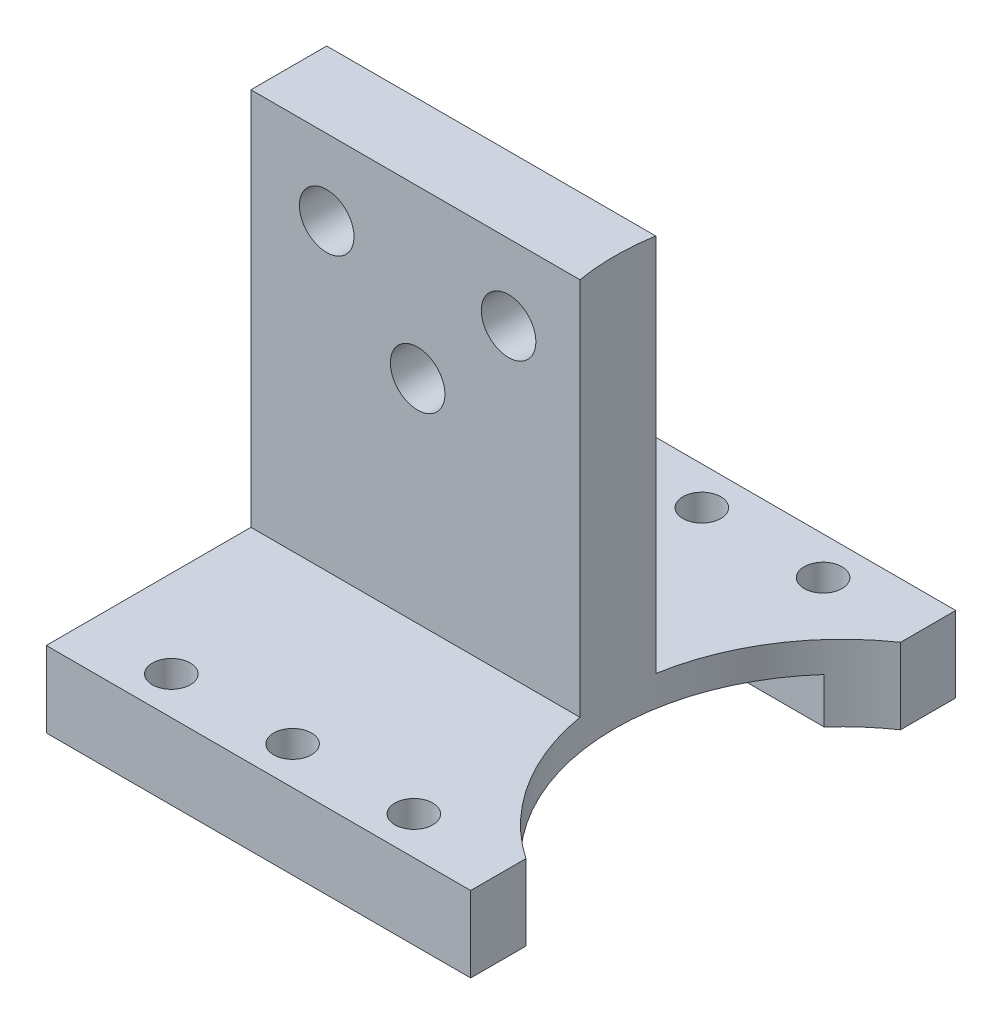
ISO-10303-21;
HEADER;
FILE_DESCRIPTION(('STEP AP214'),'2;1');
FILE_NAME('part.step','',(''),(''),'','','');
FILE_SCHEMA(('AUTOMOTIVE_DESIGN { 1 0 10303 214 1 1 1 1 }'));
ENDSEC;
DATA;
#1=APPLICATION_CONTEXT('core data for automotive mechanical design processes');
#2=APPLICATION_PROTOCOL_DEFINITION('international standard','automotive_design',2000,#1);
#3=PRODUCT_CONTEXT('',#1,'mechanical');
#4=PRODUCT('Part','Part','',(#3));
#5=PRODUCT_RELATED_PRODUCT_CATEGORY('part','',(#4));
#6=PRODUCT_DEFINITION_FORMATION('','',#4);
#7=PRODUCT_DEFINITION_CONTEXT('part definition',#1,'design');
#8=PRODUCT_DEFINITION('design','',#6,#7);
#9=PRODUCT_DEFINITION_SHAPE('','',#8);
#10=(LENGTH_UNIT() NAMED_UNIT(*) SI_UNIT(.MILLI.,.METRE.));
#11=(NAMED_UNIT(*) PLANE_ANGLE_UNIT() SI_UNIT($,.RADIAN.));
#12=(NAMED_UNIT(*) SI_UNIT($,.STERADIAN.) SOLID_ANGLE_UNIT());
#13=UNCERTAINTY_MEASURE_WITH_UNIT(LENGTH_MEASURE(1.E-05),#10,'distance_accuracy_value','');
#14=(GEOMETRIC_REPRESENTATION_CONTEXT(3) GLOBAL_UNCERTAINTY_ASSIGNED_CONTEXT((#13)) GLOBAL_UNIT_ASSIGNED_CONTEXT((#10,
#11,#12)) REPRESENTATION_CONTEXT('',''));
#15=CARTESIAN_POINT('',(0.,0.,0.));
#16=DIRECTION('',(0.,0.,1.));
#17=DIRECTION('',(1.,0.,0.));
#18=AXIS2_PLACEMENT_3D('',#15,#16,#17);
#19=CARTESIAN_POINT('',(14.,0.,0.));
#20=DIRECTION('',(-1.,0.,0.));
#21=DIRECTION('',(0.,0.,1.));
#22=AXIS2_PLACEMENT_3D('',#19,#20,#21);
#23=PLANE('',#22);
#24=DIRECTION('',(0.,0.,-1.));
#25=VECTOR('',#24,1.);
#26=CARTESIAN_POINT('',(14.,-3.,16.));
#27=LINE('',#26,#25);
#28=CARTESIAN_POINT('',(14.,-3.,16.));
#29=VERTEX_POINT('',#28);
#30=CARTESIAN_POINT('',(14.,-3.,12.3592070943073));
#31=VERTEX_POINT('',#30);
#32=EDGE_CURVE('E174',#29,#31,#27,.T.);
#33=ORIENTED_EDGE('',*,*,#32,.T.);
#34=DIRECTION('',(0.,1.,0.));
#35=VECTOR('',#34,1.);
#36=CARTESIAN_POINT('',(14.,-7.,12.3592070943073));
#37=LINE('',#36,#35);
#38=CARTESIAN_POINT('',(14.,2.,12.3592070943073));
#39=VERTEX_POINT('',#38);
#40=EDGE_CURVE('E11',#31,#39,#37,.T.);
#41=ORIENTED_EDGE('',*,*,#40,.T.);
#42=DIRECTION('',(0.,0.,1.));
#43=VECTOR('',#42,1.);
#44=CARTESIAN_POINT('',(14.,2.,2.5));
#45=LINE('',#44,#43);
#46=CARTESIAN_POINT('',(14.,2.,16.));
#47=VERTEX_POINT('',#46);
#48=EDGE_CURVE('E279',#39,#47,#45,.T.);
#49=ORIENTED_EDGE('',*,*,#48,.T.);
#50=DIRECTION('',(0.,-1.,0.));
#51=VECTOR('',#50,1.);
#52=CARTESIAN_POINT('',(14.,2.,16.));
#53=LINE('',#52,#51);
#54=EDGE_CURVE('E281',#47,#29,#53,.T.);
#55=ORIENTED_EDGE('',*,*,#54,.T.);
#56=EDGE_LOOP('',(#33,#41,#49,#55));
#57=FACE_BOUND('',#56,.T.);
#58=ADVANCED_FACE('F41',(#57),#23,.F.);
#59=CARTESIAN_POINT('',(0.,2.,0.));
#60=DIRECTION('',(0.,1.,0.));
#61=DIRECTION('',(0.,0.,1.));
#62=AXIS2_PLACEMENT_3D('',#59,#60,#61);
#63=PLANE('',#62);
#64=CARTESIAN_POINT('',(22.5000000000015,2.,0.));
#65=DIRECTION('',(0.,1.,0.));
#66=DIRECTION('',(0.,0.,1.));
#67=AXIS2_PLACEMENT_3D('',#64,#65,#66);
#68=CIRCLE('',#67,15.);
#69=CARTESIAN_POINT('',(14.,2.,-12.3592070943071));
#70=VERTEX_POINT('',#69);
#71=CARTESIAN_POINT('',(7.7098005422525,2.,-2.5));
#72=VERTEX_POINT('',#71);
#73=EDGE_CURVE('E148',#70,#72,#68,.T.);
#74=ORIENTED_EDGE('',*,*,#73,.F.);
#75=DIRECTION('',(0.,0.,1.));
#76=VECTOR('',#75,1.);
#77=CARTESIAN_POINT('',(14.,2.,-16.));
#78=LINE('',#77,#76);
#79=CARTESIAN_POINT('',(14.,2.,-16.));
#80=VERTEX_POINT('',#79);
#81=EDGE_CURVE('E265',#80,#70,#78,.T.);
#82=ORIENTED_EDGE('',*,*,#81,.F.);
#83=DIRECTION('',(1.,0.,0.));
#84=VECTOR('',#83,1.);
#85=CARTESIAN_POINT('',(0.,2.,-16.));
#86=LINE('',#85,#84);
#87=CARTESIAN_POINT('',(-14.,2.,-16.));
#88=VERTEX_POINT('',#87);
#89=EDGE_CURVE('E235',#88,#80,#86,.T.);
#90=ORIENTED_EDGE('',*,*,#89,.F.);
#91=DIRECTION('',(0.,0.,-1.));
#92=VECTOR('',#91,1.);
#93=CARTESIAN_POINT('',(-14.,2.,0.));
#94=LINE('',#93,#92);
#95=CARTESIAN_POINT('',(-14.,2.,-2.5));
#96=VERTEX_POINT('',#95);
#97=EDGE_CURVE('E237',#96,#88,#94,.T.);
#98=ORIENTED_EDGE('',*,*,#97,.F.);
#99=DIRECTION('',(-1.,0.,0.));
#100=VECTOR('',#99,1.);
#101=CARTESIAN_POINT('',(10.,2.,-2.5));
#102=LINE('',#101,#100);
#103=EDGE_CURVE('E65',#72,#96,#102,.T.);
#104=ORIENTED_EDGE('',*,*,#103,.F.);
#105=EDGE_LOOP('',(#74,#82,#90,#98,#104));
#106=FACE_BOUND('',#105,.T.);
#107=CARTESIAN_POINT('',(7.75000000000074,2.,-13.5));
#108=DIRECTION('',(0.,1.,0.));
#109=DIRECTION('',(0.,0.,1.));
#110=AXIS2_PLACEMENT_3D('',#107,#108,#109);
#111=CIRCLE('',#110,1.25);
#112=CARTESIAN_POINT('',(7.75000000000074,2.,-12.25));
#113=VERTEX_POINT('',#112);
#114=EDGE_CURVE('E220',#113,#113,#111,.T.);
#115=ORIENTED_EDGE('',*,*,#114,.F.);
#116=EDGE_LOOP('',(#115));
#117=FACE_BOUND('',#116,.T.);
#118=CARTESIAN_POINT('',(-0.249999999999261,2.,-13.4999999999999));
#119=DIRECTION('',(0.,1.,0.));
#120=DIRECTION('',(0.,0.,1.));
#121=AXIS2_PLACEMENT_3D('',#118,#119,#120);
#122=CIRCLE('',#121,1.25);
#123=CARTESIAN_POINT('',(-0.249999999999261,2.,-12.2499999999999));
#124=VERTEX_POINT('',#123);
#125=EDGE_CURVE('E217',#124,#124,#122,.T.);
#126=ORIENTED_EDGE('',*,*,#125,.F.);
#127=EDGE_LOOP('',(#126));
#128=FACE_BOUND('',#127,.T.);
#129=CARTESIAN_POINT('',(-8.24999999999926,2.,-13.4999999999999));
#130=DIRECTION('',(0.,1.,0.));
#131=DIRECTION('',(0.,0.,1.));
#132=AXIS2_PLACEMENT_3D('',#129,#130,#131);
#133=CIRCLE('',#132,1.25);
#134=CARTESIAN_POINT('',(-8.24999999999926,2.,-12.2499999999999));
#135=VERTEX_POINT('',#134);
#136=EDGE_CURVE('E178',#135,#135,#133,.T.);
#137=ORIENTED_EDGE('',*,*,#136,.F.);
#138=EDGE_LOOP('',(#137));
#139=FACE_BOUND('',#138,.T.);
#140=ADVANCED_FACE('F350',(#106,#117,#128,#139),#63,.T.);
#141=CARTESIAN_POINT('',(22.5000000000015,2.,0.));
#142=DIRECTION('',(0.,1.,0.));
#143=DIRECTION('',(0.,0.,1.));
#144=AXIS2_PLACEMENT_3D('',#141,#142,#143);
#145=CIRCLE('',#144,15.);
#146=CARTESIAN_POINT('',(7.70980054225247,2.,2.5));
#147=VERTEX_POINT('',#146);
#148=EDGE_CURVE('E274',#147,#39,#145,.T.);
#149=ORIENTED_EDGE('',*,*,#148,.F.);
#150=DIRECTION('',(1.,0.,0.));
#151=VECTOR('',#150,1.);
#152=CARTESIAN_POINT('',(9.99999999999999,2.,2.5));
#153=LINE('',#152,#151);
#154=CARTESIAN_POINT('',(-14.,2.,2.5));
#155=VERTEX_POINT('',#154);
#156=EDGE_CURVE('E171',#155,#147,#153,.T.);
#157=ORIENTED_EDGE('',*,*,#156,.F.);
#158=CARTESIAN_POINT('',(-14.,2.,16.));
#159=VERTEX_POINT('',#158);
#160=EDGE_CURVE('E183',#159,#155,#94,.T.);
#161=ORIENTED_EDGE('',*,*,#160,.F.);
#162=DIRECTION('',(1.,0.,0.));
#163=VECTOR('',#162,1.);
#164=CARTESIAN_POINT('',(0.,2.,16.));
#165=LINE('',#164,#163);
#166=EDGE_CURVE('E232',#159,#47,#165,.T.);
#167=ORIENTED_EDGE('',*,*,#166,.T.);
#168=ORIENTED_EDGE('',*,*,#48,.F.);
#169=EDGE_LOOP('',(#149,#157,#161,#167,#168));
#170=FACE_BOUND('',#169,.T.);
#171=CARTESIAN_POINT('',(-8.24999999999917,2.,13.5000000000001));
#172=DIRECTION('',(0.,1.,0.));
#173=DIRECTION('',(0.,0.,1.));
#174=AXIS2_PLACEMENT_3D('',#171,#172,#173);
#175=CIRCLE('',#174,1.25);
#176=CARTESIAN_POINT('',(-8.24999999999917,2.,14.7500000000001));
#177=VERTEX_POINT('',#176);
#178=EDGE_CURVE('E223',#177,#177,#175,.T.);
#179=ORIENTED_EDGE('',*,*,#178,.F.);
#180=EDGE_LOOP('',(#179));
#181=FACE_BOUND('',#180,.T.);
#182=CARTESIAN_POINT('',(-0.249999999999171,2.,13.5000000000001));
#183=DIRECTION('',(0.,1.,0.));
#184=DIRECTION('',(0.,0.,1.));
#185=AXIS2_PLACEMENT_3D('',#182,#183,#184);
#186=CIRCLE('',#185,1.25);
#187=CARTESIAN_POINT('',(-0.249999999999171,2.,14.7500000000001));
#188=VERTEX_POINT('',#187);
#189=EDGE_CURVE('E226',#188,#188,#186,.T.);
#190=ORIENTED_EDGE('',*,*,#189,.F.);
#191=EDGE_LOOP('',(#190));
#192=FACE_BOUND('',#191,.T.);
#193=CARTESIAN_POINT('',(7.75000000000083,2.,13.5));
#194=DIRECTION('',(0.,1.,0.));
#195=DIRECTION('',(0.,0.,1.));
#196=AXIS2_PLACEMENT_3D('',#193,#194,#195);
#197=CIRCLE('',#196,1.25);
#198=CARTESIAN_POINT('',(7.75000000000083,2.,14.75));
#199=VERTEX_POINT('',#198);
#200=EDGE_CURVE('E229',#199,#199,#197,.T.);
#201=ORIENTED_EDGE('',*,*,#200,.F.);
#202=EDGE_LOOP('',(#201));
#203=FACE_BOUND('',#202,.T.);
#204=ADVANCED_FACE('F294',(#170,#181,#192,#203),#63,.T.);
#205=CARTESIAN_POINT('',(0.,0.,0.));
#206=DIRECTION('',(0.,1.,0.));
#207=DIRECTION('',(0.,0.,1.));
#208=AXIS2_PLACEMENT_3D('',#205,#206,#207);
#209=PLANE('',#208);
#210=DIRECTION('',(-1.,0.,0.));
#211=VECTOR('',#210,1.);
#212=CARTESIAN_POINT('',(-10.,0.,-10.));
#213=LINE('',#212,#211);
#214=CARTESIAN_POINT('',(11.3196601125026,0.,-10.));
#215=VERTEX_POINT('',#214);
#216=CARTESIAN_POINT('',(-10.,0.,-10.));
#217=VERTEX_POINT('',#216);
#218=EDGE_CURVE('E242',#215,#217,#213,.T.);
#219=ORIENTED_EDGE('',*,*,#218,.F.);
#220=CARTESIAN_POINT('',(22.5000000000015,0.,0.));
#221=DIRECTION('',(0.,1.,0.));
#222=DIRECTION('',(0.,0.,1.));
#223=AXIS2_PLACEMENT_3D('',#220,#221,#222);
#224=CIRCLE('',#223,15.);
#225=CARTESIAN_POINT('',(11.3196601125025,0.,10.));
#226=VERTEX_POINT('',#225);
#227=EDGE_CURVE('E303',#215,#226,#224,.T.);
#228=ORIENTED_EDGE('',*,*,#227,.T.);
#229=DIRECTION('',(1.,0.,0.));
#230=VECTOR('',#229,1.);
#231=CARTESIAN_POINT('',(-10.,0.,10.));
#232=LINE('',#231,#230);
#233=CARTESIAN_POINT('',(-10.,0.,10.));
#234=VERTEX_POINT('',#233);
#235=EDGE_CURVE('E255',#234,#226,#232,.T.);
#236=ORIENTED_EDGE('',*,*,#235,.F.);
#237=DIRECTION('',(0.,0.,1.));
#238=VECTOR('',#237,1.);
#239=CARTESIAN_POINT('',(-10.,0.,-10.));
#240=LINE('',#239,#238);
#241=EDGE_CURVE('E252',#217,#234,#240,.T.);
#242=ORIENTED_EDGE('',*,*,#241,.F.);
#243=EDGE_LOOP('',(#219,#228,#236,#242));
#244=FACE_BOUND('',#243,.T.);
#245=ADVANCED_FACE('F43',(#244),#209,.F.);
#246=CARTESIAN_POINT('',(0.,-3.,-10.));
#247=DIRECTION('',(0.,0.,-1.));
#248=DIRECTION('',(-1.,0.,0.));
#249=AXIS2_PLACEMENT_3D('',#246,#247,#248);
#250=PLANE('',#249);
#251=DIRECTION('',(-1.,0.,0.));
#252=VECTOR('',#251,1.);
#253=CARTESIAN_POINT('',(0.,-3.,-10.));
#254=LINE('',#253,#252);
#255=CARTESIAN_POINT('',(11.3196601125026,-3.,-10.));
#256=VERTEX_POINT('',#255);
#257=CARTESIAN_POINT('',(-10.,-3.,-10.));
#258=VERTEX_POINT('',#257);
#259=EDGE_CURVE('E206',#256,#258,#254,.T.);
#260=ORIENTED_EDGE('',*,*,#259,.F.);
#261=DIRECTION('',(0.,1.,0.));
#262=VECTOR('',#261,1.);
#263=CARTESIAN_POINT('',(11.3196601125026,-7.,-10.));
#264=LINE('',#263,#262);
#265=EDGE_CURVE('E306',#256,#215,#264,.T.);
#266=ORIENTED_EDGE('',*,*,#265,.T.);
#267=ORIENTED_EDGE('',*,*,#218,.T.);
#268=DIRECTION('',(0.,1.,0.));
#269=VECTOR('',#268,1.);
#270=CARTESIAN_POINT('',(-10.,-3.,-10.));
#271=LINE('',#270,#269);
#272=EDGE_CURVE('E246',#258,#217,#271,.T.);
#273=ORIENTED_EDGE('',*,*,#272,.F.);
#274=EDGE_LOOP('',(#260,#266,#267,#273));
#275=FACE_BOUND('',#274,.T.);
#276=ADVANCED_FACE('F449',(#275),#250,.F.);
#277=CARTESIAN_POINT('',(-10.,-3.,0.));
#278=DIRECTION('',(-1.,0.,0.));
#279=DIRECTION('',(0.,0.,1.));
#280=AXIS2_PLACEMENT_3D('',#277,#278,#279);
#281=PLANE('',#280);
#282=ORIENTED_EDGE('',*,*,#272,.T.);
#283=ORIENTED_EDGE('',*,*,#241,.T.);
#284=DIRECTION('',(0.,1.,0.));
#285=VECTOR('',#284,1.);
#286=CARTESIAN_POINT('',(-10.,-3.,10.));
#287=LINE('',#286,#285);
#288=CARTESIAN_POINT('',(-10.,-3.,10.));
#289=VERTEX_POINT('',#288);
#290=EDGE_CURVE('E214',#289,#234,#287,.T.);
#291=ORIENTED_EDGE('',*,*,#290,.F.);
#292=DIRECTION('',(0.,0.,1.));
#293=VECTOR('',#292,1.);
#294=CARTESIAN_POINT('',(-10.,-3.,0.));
#295=LINE('',#294,#293);
#296=EDGE_CURVE('E203',#258,#289,#295,.T.);
#297=ORIENTED_EDGE('',*,*,#296,.F.);
#298=EDGE_LOOP('',(#282,#283,#291,#297));
#299=FACE_BOUND('',#298,.T.);
#300=ADVANCED_FACE('F441',(#299),#281,.F.);
#301=CARTESIAN_POINT('',(0.,-3.,10.));
#302=DIRECTION('',(0.,0.,1.));
#303=DIRECTION('',(1.,0.,0.));
#304=AXIS2_PLACEMENT_3D('',#301,#302,#303);
#305=PLANE('',#304);
#306=ORIENTED_EDGE('',*,*,#235,.T.);
#307=DIRECTION('',(0.,1.,0.));
#308=VECTOR('',#307,1.);
#309=CARTESIAN_POINT('',(11.3196601125025,-7.,10.));
#310=LINE('',#309,#308);
#311=CARTESIAN_POINT('',(11.3196601125025,-3.,10.));
#312=VERTEX_POINT('',#311);
#313=EDGE_CURVE('E150',#226,#312,#310,.F.);
#314=ORIENTED_EDGE('',*,*,#313,.T.);
#315=DIRECTION('',(1.,0.,0.));
#316=VECTOR('',#315,1.);
#317=CARTESIAN_POINT('',(0.,-3.,10.));
#318=LINE('',#317,#316);
#319=EDGE_CURVE('E200',#289,#312,#318,.T.);
#320=ORIENTED_EDGE('',*,*,#319,.F.);
#321=ORIENTED_EDGE('',*,*,#290,.T.);
#322=EDGE_LOOP('',(#306,#314,#320,#321));
#323=FACE_BOUND('',#322,.T.);
#324=ADVANCED_FACE('F436',(#323),#305,.F.);
#325=CARTESIAN_POINT('',(0.,-3.,16.));
#326=DIRECTION('',(0.,0.,1.));
#327=DIRECTION('',(1.,0.,0.));
#328=AXIS2_PLACEMENT_3D('',#325,#326,#327);
#329=PLANE('',#328);
#330=ORIENTED_EDGE('',*,*,#166,.F.);
#331=DIRECTION('',(0.,1.,0.));
#332=VECTOR('',#331,1.);
#333=CARTESIAN_POINT('',(-14.,-3.,16.));
#334=LINE('',#333,#332);
#335=CARTESIAN_POINT('',(-14.,-3.,16.));
#336=VERTEX_POINT('',#335);
#337=EDGE_CURVE('E240',#336,#159,#334,.T.);
#338=ORIENTED_EDGE('',*,*,#337,.F.);
#339=DIRECTION('',(1.,0.,0.));
#340=VECTOR('',#339,1.);
#341=CARTESIAN_POINT('',(0.,-3.,16.));
#342=LINE('',#341,#340);
#343=EDGE_CURVE('E198',#336,#29,#342,.T.);
#344=ORIENTED_EDGE('',*,*,#343,.T.);
#345=ORIENTED_EDGE('',*,*,#54,.F.);
#346=EDGE_LOOP('',(#330,#338,#344,#345));
#347=FACE_BOUND('',#346,.T.);
#348=ADVANCED_FACE('F440',(#347),#329,.T.);
#349=CARTESIAN_POINT('',(-14.,-3.,0.));
#350=DIRECTION('',(1.,0.,0.));
#351=DIRECTION('',(0.,0.,-1.));
#352=AXIS2_PLACEMENT_3D('',#349,#350,#351);
#353=PLANE('',#352);
#354=ORIENTED_EDGE('',*,*,#160,.T.);
#355=DIRECTION('',(0.,-1.,0.));
#356=VECTOR('',#355,1.);
#357=CARTESIAN_POINT('',(-14.,27.,2.5));
#358=LINE('',#357,#356);
#359=CARTESIAN_POINT('',(-14.,27.,2.5));
#360=VERTEX_POINT('',#359);
#361=EDGE_CURVE('E165',#360,#155,#358,.T.);
#362=ORIENTED_EDGE('',*,*,#361,.F.);
#363=DIRECTION('',(0.,0.,1.));
#364=VECTOR('',#363,1.);
#365=CARTESIAN_POINT('',(-14.,27.,-2.5));
#366=LINE('',#365,#364);
#367=CARTESIAN_POINT('',(-14.,27.,-2.5));
#368=VERTEX_POINT('',#367);
#369=EDGE_CURVE('E167',#368,#360,#366,.T.);
#370=ORIENTED_EDGE('',*,*,#369,.F.);
#371=DIRECTION('',(0.,-1.,0.));
#372=VECTOR('',#371,1.);
#373=CARTESIAN_POINT('',(-14.,27.,-2.5));
#374=LINE('',#373,#372);
#375=EDGE_CURVE('E162',#368,#96,#374,.T.);
#376=ORIENTED_EDGE('',*,*,#375,.T.);
#377=ORIENTED_EDGE('',*,*,#97,.T.);
#378=DIRECTION('',(0.,1.,0.));
#379=VECTOR('',#378,1.);
#380=CARTESIAN_POINT('',(-14.,-3.,-16.));
#381=LINE('',#380,#379);
#382=CARTESIAN_POINT('',(-14.,-3.,-16.));
#383=VERTEX_POINT('',#382);
#384=EDGE_CURVE('E243',#383,#88,#381,.T.);
#385=ORIENTED_EDGE('',*,*,#384,.F.);
#386=DIRECTION('',(0.,0.,-1.));
#387=VECTOR('',#386,1.);
#388=CARTESIAN_POINT('',(-14.,-3.,0.));
#389=LINE('',#388,#387);
#390=EDGE_CURVE('E211',#336,#383,#389,.T.);
#391=ORIENTED_EDGE('',*,*,#390,.F.);
#392=ORIENTED_EDGE('',*,*,#337,.T.);
#393=EDGE_LOOP('',(#354,#362,#370,#376,#377,#385,#391,#392));
#394=FACE_BOUND('',#393,.T.);
#395=ADVANCED_FACE('F287',(#394),#353,.F.);
#396=CARTESIAN_POINT('',(0.,-3.,-16.));
#397=DIRECTION('',(0.,0.,1.));
#398=DIRECTION('',(1.,0.,0.));
#399=AXIS2_PLACEMENT_3D('',#396,#397,#398);
#400=PLANE('',#399);
#401=ORIENTED_EDGE('',*,*,#89,.T.);
#402=DIRECTION('',(0.,1.,0.));
#403=VECTOR('',#402,1.);
#404=CARTESIAN_POINT('',(14.,-3.,-16.));
#405=LINE('',#404,#403);
#406=CARTESIAN_POINT('',(14.,-3.,-16.));
#407=VERTEX_POINT('',#406);
#408=EDGE_CURVE('E270',#407,#80,#405,.T.);
#409=ORIENTED_EDGE('',*,*,#408,.F.);
#410=DIRECTION('',(1.,0.,0.));
#411=VECTOR('',#410,1.);
#412=CARTESIAN_POINT('',(0.,-3.,-16.));
#413=LINE('',#412,#411);
#414=EDGE_CURVE('E208',#383,#407,#413,.T.);
#415=ORIENTED_EDGE('',*,*,#414,.F.);
#416=ORIENTED_EDGE('',*,*,#384,.T.);
#417=EDGE_LOOP('',(#401,#409,#415,#416));
#418=FACE_BOUND('',#417,.T.);
#419=ADVANCED_FACE('F535',(#418),#400,.F.);
#420=CARTESIAN_POINT('',(7.75000000000083,-3.,13.5));
#421=DIRECTION('',(0.,1.,0.));
#422=DIRECTION('',(0.,0.,1.));
#423=AXIS2_PLACEMENT_3D('',#420,#421,#422);
#424=CYLINDRICAL_SURFACE('',#423,1.25);
#425=CARTESIAN_POINT('',(7.75000000000083,-3.,13.5));
#426=DIRECTION('',(0.,1.,0.));
#427=DIRECTION('',(0.,0.,1.));
#428=AXIS2_PLACEMENT_3D('',#425,#426,#427);
#429=CIRCLE('',#428,1.25);
#430=CARTESIAN_POINT('',(7.75000000000083,-3.,14.75));
#431=VERTEX_POINT('',#430);
#432=EDGE_CURVE('E195',#431,#431,#429,.T.);
#433=ORIENTED_EDGE('',*,*,#432,.F.);
#434=EDGE_LOOP('',(#433));
#435=FACE_BOUND('',#434,.T.);
#436=ORIENTED_EDGE('',*,*,#200,.T.);
#437=EDGE_LOOP('',(#436));
#438=FACE_BOUND('',#437,.T.);
#439=ADVANCED_FACE('F526',(#435,#438),#424,.F.);
#440=CARTESIAN_POINT('',(-0.249999999999171,-3.,13.5000000000001));
#441=DIRECTION('',(0.,1.,0.));
#442=DIRECTION('',(0.,0.,1.));
#443=AXIS2_PLACEMENT_3D('',#440,#441,#442);
#444=CYLINDRICAL_SURFACE('',#443,1.25);
#445=CARTESIAN_POINT('',(-0.249999999999171,-3.,13.5000000000001));
#446=DIRECTION('',(0.,1.,0.));
#447=DIRECTION('',(0.,0.,1.));
#448=AXIS2_PLACEMENT_3D('',#445,#446,#447);
#449=CIRCLE('',#448,1.25);
#450=CARTESIAN_POINT('',(-0.249999999999171,-3.,14.7500000000001));
#451=VERTEX_POINT('',#450);
#452=EDGE_CURVE('E192',#451,#451,#449,.T.);
#453=ORIENTED_EDGE('',*,*,#452,.F.);
#454=EDGE_LOOP('',(#453));
#455=FACE_BOUND('',#454,.T.);
#456=ORIENTED_EDGE('',*,*,#189,.T.);
#457=EDGE_LOOP('',(#456));
#458=FACE_BOUND('',#457,.T.);
#459=ADVANCED_FACE('F517',(#455,#458),#444,.F.);
#460=CARTESIAN_POINT('',(-8.24999999999917,-3.,13.5000000000001));
#461=DIRECTION('',(0.,1.,0.));
#462=DIRECTION('',(0.,0.,1.));
#463=AXIS2_PLACEMENT_3D('',#460,#461,#462);
#464=CYLINDRICAL_SURFACE('',#463,1.25);
#465=CARTESIAN_POINT('',(-8.24999999999917,-3.,13.5000000000001));
#466=DIRECTION('',(0.,1.,0.));
#467=DIRECTION('',(0.,0.,1.));
#468=AXIS2_PLACEMENT_3D('',#465,#466,#467);
#469=CIRCLE('',#468,1.25);
#470=CARTESIAN_POINT('',(-8.24999999999917,-3.,14.7500000000001));
#471=VERTEX_POINT('',#470);
#472=EDGE_CURVE('E189',#471,#471,#469,.T.);
#473=ORIENTED_EDGE('',*,*,#472,.F.);
#474=EDGE_LOOP('',(#473));
#475=FACE_BOUND('',#474,.T.);
#476=ORIENTED_EDGE('',*,*,#178,.T.);
#477=EDGE_LOOP('',(#476));
#478=FACE_BOUND('',#477,.T.);
#479=ADVANCED_FACE('F508',(#475,#478),#464,.F.);
#480=CARTESIAN_POINT('',(7.75000000000074,-3.,-13.5));
#481=DIRECTION('',(0.,1.,0.));
#482=DIRECTION('',(0.,0.,1.));
#483=AXIS2_PLACEMENT_3D('',#480,#481,#482);
#484=CYLINDRICAL_SURFACE('',#483,1.25);
#485=CARTESIAN_POINT('',(7.75000000000074,-3.,-13.5));
#486=DIRECTION('',(0.,1.,0.));
#487=DIRECTION('',(0.,0.,1.));
#488=AXIS2_PLACEMENT_3D('',#485,#486,#487);
#489=CIRCLE('',#488,1.25);
#490=CARTESIAN_POINT('',(7.75000000000074,-3.,-12.25));
#491=VERTEX_POINT('',#490);
#492=EDGE_CURVE('E186',#491,#491,#489,.T.);
#493=ORIENTED_EDGE('',*,*,#492,.F.);
#494=EDGE_LOOP('',(#493));
#495=FACE_BOUND('',#494,.T.);
#496=ORIENTED_EDGE('',*,*,#114,.T.);
#497=EDGE_LOOP('',(#496));
#498=FACE_BOUND('',#497,.T.);
#499=ADVANCED_FACE('F499',(#495,#498),#484,.F.);
#500=CARTESIAN_POINT('',(-0.249999999999261,-3.,-13.4999999999999));
#501=DIRECTION('',(0.,1.,0.));
#502=DIRECTION('',(0.,0.,1.));
#503=AXIS2_PLACEMENT_3D('',#500,#501,#502);
#504=CYLINDRICAL_SURFACE('',#503,1.25);
#505=CARTESIAN_POINT('',(-0.249999999999261,-3.,-13.4999999999999));
#506=DIRECTION('',(0.,1.,0.));
#507=DIRECTION('',(0.,0.,1.));
#508=AXIS2_PLACEMENT_3D('',#505,#506,#507);
#509=CIRCLE('',#508,1.25);
#510=CARTESIAN_POINT('',(-0.249999999999261,-3.,-12.2499999999999));
#511=VERTEX_POINT('',#510);
#512=EDGE_CURVE('E182',#511,#511,#509,.T.);
#513=ORIENTED_EDGE('',*,*,#512,.F.);
#514=EDGE_LOOP('',(#513));
#515=FACE_BOUND('',#514,.T.);
#516=ORIENTED_EDGE('',*,*,#125,.T.);
#517=EDGE_LOOP('',(#516));
#518=FACE_BOUND('',#517,.T.);
#519=ADVANCED_FACE('F490',(#515,#518),#504,.F.);
#520=CARTESIAN_POINT('',(-8.24999999999926,-3.,-13.4999999999999));
#521=DIRECTION('',(0.,1.,0.));
#522=DIRECTION('',(0.,0.,1.));
#523=AXIS2_PLACEMENT_3D('',#520,#521,#522);
#524=CYLINDRICAL_SURFACE('',#523,1.25);
#525=CARTESIAN_POINT('',(-8.24999999999926,-3.,-13.4999999999999));
#526=DIRECTION('',(0.,1.,0.));
#527=DIRECTION('',(0.,0.,1.));
#528=AXIS2_PLACEMENT_3D('',#525,#526,#527);
#529=CIRCLE('',#528,1.25);
#530=CARTESIAN_POINT('',(-8.24999999999926,-3.,-12.2499999999999));
#531=VERTEX_POINT('',#530);
#532=EDGE_CURVE('E179',#531,#531,#529,.T.);
#533=ORIENTED_EDGE('',*,*,#532,.F.);
#534=EDGE_LOOP('',(#533));
#535=FACE_BOUND('',#534,.T.);
#536=ORIENTED_EDGE('',*,*,#136,.T.);
#537=EDGE_LOOP('',(#536));
#538=FACE_BOUND('',#537,.T.);
#539=ADVANCED_FACE('F427',(#535,#538),#524,.F.);
#540=CARTESIAN_POINT('',(0.,-3.,0.));
#541=DIRECTION('',(0.,1.,0.));
#542=DIRECTION('',(0.,0.,1.));
#543=AXIS2_PLACEMENT_3D('',#540,#541,#542);
#544=PLANE('',#543);
#545=ORIENTED_EDGE('',*,*,#532,.T.);
#546=EDGE_LOOP('',(#545));
#547=FACE_BOUND('',#546,.T.);
#548=ORIENTED_EDGE('',*,*,#512,.T.);
#549=EDGE_LOOP('',(#548));
#550=FACE_BOUND('',#549,.T.);
#551=ORIENTED_EDGE('',*,*,#492,.T.);
#552=EDGE_LOOP('',(#551));
#553=FACE_BOUND('',#552,.T.);
#554=ORIENTED_EDGE('',*,*,#472,.T.);
#555=EDGE_LOOP('',(#554));
#556=FACE_BOUND('',#555,.T.);
#557=ORIENTED_EDGE('',*,*,#452,.T.);
#558=EDGE_LOOP('',(#557));
#559=FACE_BOUND('',#558,.T.);
#560=ORIENTED_EDGE('',*,*,#432,.T.);
#561=EDGE_LOOP('',(#560));
#562=FACE_BOUND('',#561,.T.);
#563=DIRECTION('',(0.,0.,-1.));
#564=VECTOR('',#563,1.);
#565=CARTESIAN_POINT('',(14.,-3.,-10.));
#566=LINE('',#565,#564);
#567=CARTESIAN_POINT('',(14.,-3.,-12.3592070943071));
#568=VERTEX_POINT('',#567);
#569=EDGE_CURVE('E263',#568,#407,#566,.T.);
#570=ORIENTED_EDGE('',*,*,#569,.F.);
#571=CARTESIAN_POINT('',(22.5000000000015,-3.,0.));
#572=DIRECTION('',(0.,1.,0.));
#573=DIRECTION('',(0.,0.,1.));
#574=AXIS2_PLACEMENT_3D('',#571,#572,#573);
#575=CIRCLE('',#574,15.);
#576=EDGE_CURVE('E57',#568,#256,#575,.T.);
#577=ORIENTED_EDGE('',*,*,#576,.T.);
#578=ORIENTED_EDGE('',*,*,#259,.T.);
#579=ORIENTED_EDGE('',*,*,#296,.T.);
#580=ORIENTED_EDGE('',*,*,#319,.T.);
#581=EDGE_CURVE('E296',#312,#31,#575,.T.);
#582=ORIENTED_EDGE('',*,*,#581,.T.);
#583=ORIENTED_EDGE('',*,*,#32,.F.);
#584=ORIENTED_EDGE('',*,*,#343,.F.);
#585=ORIENTED_EDGE('',*,*,#390,.T.);
#586=ORIENTED_EDGE('',*,*,#414,.T.);
#587=EDGE_LOOP('',(#570,#577,#578,#579,#580,#582,#583,#584,#585,#586));
#588=FACE_BOUND('',#587,.T.);
#589=ADVANCED_FACE('F267',(#547,#550,#553,#556,#559,#562,#588),#544,.F.);
#590=CARTESIAN_POINT('',(9.99999999999999,27.,2.5));
#591=DIRECTION('',(0.,0.,-1.));
#592=DIRECTION('',(-1.,0.,0.));
#593=AXIS2_PLACEMENT_3D('',#590,#591,#592);
#594=PLANE('',#593);
#595=CARTESIAN_POINT('',(3.,22.,2.5));
#596=DIRECTION('',(0.,0.,1.));
#597=DIRECTION('',(1.,0.,0.));
#598=AXIS2_PLACEMENT_3D('',#595,#596,#597);
#599=CIRCLE('',#598,1.8);
#600=CARTESIAN_POINT('',(4.8,22.,2.5));
#601=VERTEX_POINT('',#600);
#602=EDGE_CURVE('E320',#601,#601,#599,.T.);
#603=ORIENTED_EDGE('',*,*,#602,.F.);
#604=EDGE_LOOP('',(#603));
#605=FACE_BOUND('',#604,.T.);
#606=CARTESIAN_POINT('',(-9.,22.,2.5));
#607=DIRECTION('',(0.,0.,1.));
#608=DIRECTION('',(1.,0.,0.));
#609=AXIS2_PLACEMENT_3D('',#606,#607,#608);
#610=CIRCLE('',#609,1.8);
#611=CARTESIAN_POINT('',(-7.2,22.,2.5));
#612=VERTEX_POINT('',#611);
#613=EDGE_CURVE('E314',#612,#612,#610,.T.);
#614=ORIENTED_EDGE('',*,*,#613,.F.);
#615=EDGE_LOOP('',(#614));
#616=FACE_BOUND('',#615,.T.);
#617=CARTESIAN_POINT('',(-3.,16.,2.5));
#618=DIRECTION('',(0.,0.,1.));
#619=DIRECTION('',(1.,0.,0.));
#620=AXIS2_PLACEMENT_3D('',#617,#618,#619);
#621=CIRCLE('',#620,1.8);
#622=CARTESIAN_POINT('',(-1.2,16.,2.5));
#623=VERTEX_POINT('',#622);
#624=EDGE_CURVE('E311',#623,#623,#621,.T.);
#625=ORIENTED_EDGE('',*,*,#624,.F.);
#626=EDGE_LOOP('',(#625));
#627=FACE_BOUND('',#626,.T.);
#628=ORIENTED_EDGE('',*,*,#156,.T.);
#629=DIRECTION('',(0.,1.,0.));
#630=VECTOR('',#629,1.);
#631=CARTESIAN_POINT('',(7.70980054225247,-7.,2.5));
#632=LINE('',#631,#630);
#633=CARTESIAN_POINT('',(7.70980054225247,27.,2.5));
#634=VERTEX_POINT('',#633);
#635=EDGE_CURVE('E271',#147,#634,#632,.T.);
#636=ORIENTED_EDGE('',*,*,#635,.T.);
#637=DIRECTION('',(1.,0.,0.));
#638=VECTOR('',#637,1.);
#639=CARTESIAN_POINT('',(9.99999999999999,27.,2.5));
#640=LINE('',#639,#638);
#641=EDGE_CURVE('E157',#360,#634,#640,.T.);
#642=ORIENTED_EDGE('',*,*,#641,.F.);
#643=ORIENTED_EDGE('',*,*,#361,.T.);
#644=EDGE_LOOP('',(#628,#636,#642,#643));
#645=FACE_BOUND('',#644,.T.);
#646=ADVANCED_FACE('F290',(#605,#616,#627,#645),#594,.F.);
#647=CARTESIAN_POINT('',(10.,27.,-2.5));
#648=DIRECTION('',(0.,0.,1.));
#649=DIRECTION('',(1.,0.,0.));
#650=AXIS2_PLACEMENT_3D('',#647,#648,#649);
#651=PLANE('',#650);
#652=CARTESIAN_POINT('',(3.,22.,-2.5));
#653=DIRECTION('',(0.,0.,1.));
#654=DIRECTION('',(1.,0.,0.));
#655=AXIS2_PLACEMENT_3D('',#652,#653,#654);
#656=CIRCLE('',#655,1.8);
#657=CARTESIAN_POINT('',(4.8,22.,-2.5));
#658=VERTEX_POINT('',#657);
#659=EDGE_CURVE('E317',#658,#658,#656,.T.);
#660=ORIENTED_EDGE('',*,*,#659,.T.);
#661=EDGE_LOOP('',(#660));
#662=FACE_BOUND('',#661,.T.);
#663=CARTESIAN_POINT('',(-9.,22.,-2.5));
#664=DIRECTION('',(0.,0.,1.));
#665=DIRECTION('',(1.,0.,0.));
#666=AXIS2_PLACEMENT_3D('',#663,#664,#665);
#667=CIRCLE('',#666,1.8);
#668=CARTESIAN_POINT('',(-7.2,22.,-2.5));
#669=VERTEX_POINT('',#668);
#670=EDGE_CURVE('E45',#669,#669,#667,.T.);
#671=ORIENTED_EDGE('',*,*,#670,.T.);
#672=EDGE_LOOP('',(#671));
#673=FACE_BOUND('',#672,.T.);
#674=CARTESIAN_POINT('',(-3.,16.,-2.5));
#675=DIRECTION('',(0.,0.,1.));
#676=DIRECTION('',(1.,0.,0.));
#677=AXIS2_PLACEMENT_3D('',#674,#675,#676);
#678=CIRCLE('',#677,1.8);
#679=CARTESIAN_POINT('',(-1.2,16.,-2.5));
#680=VERTEX_POINT('',#679);
#681=EDGE_CURVE('E158',#680,#680,#678,.T.);
#682=ORIENTED_EDGE('',*,*,#681,.T.);
#683=EDGE_LOOP('',(#682));
#684=FACE_BOUND('',#683,.T.);
#685=DIRECTION('',(-1.,0.,0.));
#686=VECTOR('',#685,1.);
#687=CARTESIAN_POINT('',(10.,27.,-2.5));
#688=LINE('',#687,#686);
#689=CARTESIAN_POINT('',(7.7098005422525,27.,-2.5));
#690=VERTEX_POINT('',#689);
#691=EDGE_CURVE('E156',#690,#368,#688,.T.);
#692=ORIENTED_EDGE('',*,*,#691,.F.);
#693=DIRECTION('',(0.,1.,0.));
#694=VECTOR('',#693,1.);
#695=CARTESIAN_POINT('',(7.7098005422525,-7.,-2.5));
#696=LINE('',#695,#694);
#697=EDGE_CURVE('E142',#690,#72,#696,.F.);
#698=ORIENTED_EDGE('',*,*,#697,.T.);
#699=ORIENTED_EDGE('',*,*,#103,.T.);
#700=ORIENTED_EDGE('',*,*,#375,.F.);
#701=EDGE_LOOP('',(#692,#698,#699,#700));
#702=FACE_BOUND('',#701,.T.);
#703=ADVANCED_FACE('F160',(#662,#673,#684,#702),#651,.F.);
#704=CARTESIAN_POINT('',(0.,27.,0.));
#705=DIRECTION('',(0.,-1.,0.));
#706=DIRECTION('',(0.,0.,-1.));
#707=AXIS2_PLACEMENT_3D('',#704,#705,#706);
#708=PLANE('',#707);
#709=ORIENTED_EDGE('',*,*,#641,.T.);
#710=CARTESIAN_POINT('',(22.5000000000015,27.,0.));
#711=DIRECTION('',(0.,1.,0.));
#712=DIRECTION('',(0.,0.,1.));
#713=AXIS2_PLACEMENT_3D('',#710,#711,#712);
#714=CIRCLE('',#713,15.);
#715=EDGE_CURVE('E145',#690,#634,#714,.T.);
#716=ORIENTED_EDGE('',*,*,#715,.F.);
#717=ORIENTED_EDGE('',*,*,#691,.T.);
#718=ORIENTED_EDGE('',*,*,#369,.T.);
#719=EDGE_LOOP('',(#709,#716,#717,#718));
#720=FACE_BOUND('',#719,.T.);
#721=ADVANCED_FACE('F154',(#720),#708,.F.);
#722=ORIENTED_EDGE('',*,*,#81,.T.);
#723=DIRECTION('',(0.,1.,0.));
#724=VECTOR('',#723,1.);
#725=CARTESIAN_POINT('',(14.,-7.,-12.3592070943071));
#726=LINE('',#725,#724);
#727=EDGE_CURVE('E50',#70,#568,#726,.F.);
#728=ORIENTED_EDGE('',*,*,#727,.T.);
#729=ORIENTED_EDGE('',*,*,#569,.T.);
#730=ORIENTED_EDGE('',*,*,#408,.T.);
#731=EDGE_LOOP('',(#722,#728,#729,#730));
#732=FACE_BOUND('',#731,.T.);
#733=ADVANCED_FACE('F261',(#732),#23,.F.);
#734=CARTESIAN_POINT('',(22.5000000000015,-7.,0.));
#735=DIRECTION('',(0.,1.,0.));
#736=DIRECTION('',(0.,0.,1.));
#737=AXIS2_PLACEMENT_3D('',#734,#735,#736);
#738=CYLINDRICAL_SURFACE('',#737,15.);
#739=ORIENTED_EDGE('',*,*,#148,.T.);
#740=ORIENTED_EDGE('',*,*,#40,.F.);
#741=ORIENTED_EDGE('',*,*,#581,.F.);
#742=ORIENTED_EDGE('',*,*,#313,.F.);
#743=ORIENTED_EDGE('',*,*,#227,.F.);
#744=ORIENTED_EDGE('',*,*,#265,.F.);
#745=ORIENTED_EDGE('',*,*,#576,.F.);
#746=ORIENTED_EDGE('',*,*,#727,.F.);
#747=ORIENTED_EDGE('',*,*,#73,.T.);
#748=ORIENTED_EDGE('',*,*,#697,.F.);
#749=ORIENTED_EDGE('',*,*,#715,.T.);
#750=ORIENTED_EDGE('',*,*,#635,.F.);
#751=EDGE_LOOP('',(#739,#740,#741,#742,#743,#744,#745,#746,#747,#748,#749,#750));
#752=FACE_BOUND('',#751,.T.);
#753=ADVANCED_FACE('F144',(#752),#738,.F.);
#754=CARTESIAN_POINT('',(-3.,16.,2.5));
#755=DIRECTION('',(0.,0.,1.));
#756=DIRECTION('',(1.,0.,0.));
#757=AXIS2_PLACEMENT_3D('',#754,#755,#756);
#758=CYLINDRICAL_SURFACE('',#757,1.8);
#759=ORIENTED_EDGE('',*,*,#624,.T.);
#760=EDGE_LOOP('',(#759));
#761=FACE_BOUND('',#760,.T.);
#762=ORIENTED_EDGE('',*,*,#681,.F.);
#763=EDGE_LOOP('',(#762));
#764=FACE_BOUND('',#763,.T.);
#765=ADVANCED_FACE('F334',(#761,#764),#758,.F.);
#766=CARTESIAN_POINT('',(-9.,22.,2.5));
#767=DIRECTION('',(0.,0.,1.));
#768=DIRECTION('',(1.,0.,0.));
#769=AXIS2_PLACEMENT_3D('',#766,#767,#768);
#770=CYLINDRICAL_SURFACE('',#769,1.8);
#771=ORIENTED_EDGE('',*,*,#613,.T.);
#772=EDGE_LOOP('',(#771));
#773=FACE_BOUND('',#772,.T.);
#774=ORIENTED_EDGE('',*,*,#670,.F.);
#775=EDGE_LOOP('',(#774));
#776=FACE_BOUND('',#775,.T.);
#777=ADVANCED_FACE('F337',(#773,#776),#770,.F.);
#778=CARTESIAN_POINT('',(3.,22.,2.5));
#779=DIRECTION('',(0.,0.,1.));
#780=DIRECTION('',(1.,0.,0.));
#781=AXIS2_PLACEMENT_3D('',#778,#779,#780);
#782=CYLINDRICAL_SURFACE('',#781,1.8);
#783=ORIENTED_EDGE('',*,*,#602,.T.);
#784=EDGE_LOOP('',(#783));
#785=FACE_BOUND('',#784,.T.);
#786=ORIENTED_EDGE('',*,*,#659,.F.);
#787=EDGE_LOOP('',(#786));
#788=FACE_BOUND('',#787,.T.);
#789=ADVANCED_FACE('F324',(#785,#788),#782,.F.);
#790=CLOSED_SHELL('',(#58,#140,#204,#245,#276,#300,#324,#348,#395,#419,#439,#459,#479,#499,#519,
#539,#589,#646,#703,#721,#733,#753,#765,#777,#789));
#791=MANIFOLD_SOLID_BREP('B2',#790);
#792=ADVANCED_BREP_SHAPE_REPRESENTATION('',(#18,#791),#14);
#793=SHAPE_DEFINITION_REPRESENTATION(#9,#792);
ENDSEC;
END-ISO-10303-21;
